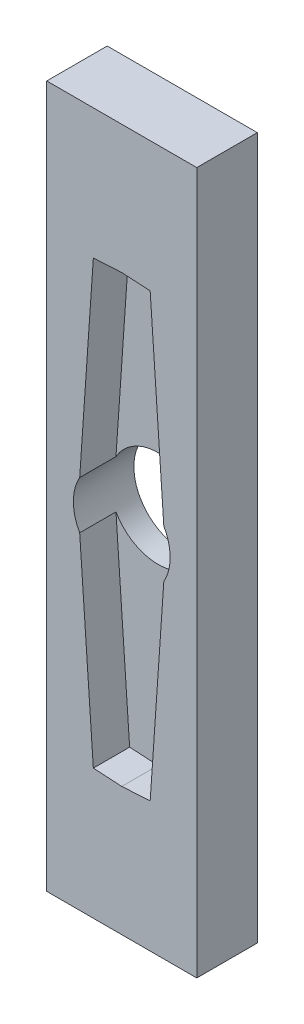
ISO-10303-21;
HEADER;
FILE_DESCRIPTION(('STEP AP214'),'2;1');
FILE_NAME('part.step','',(''),(''),'','','');
FILE_SCHEMA(('AUTOMOTIVE_DESIGN { 1 0 10303 214 1 1 1 1 }'));
ENDSEC;
DATA;
#1=APPLICATION_CONTEXT('core data for automotive mechanical design processes');
#2=APPLICATION_PROTOCOL_DEFINITION('international standard','automotive_design',2000,#1);
#3=PRODUCT_CONTEXT('',#1,'mechanical');
#4=PRODUCT('Part','Part','',(#3));
#5=PRODUCT_RELATED_PRODUCT_CATEGORY('part','',(#4));
#6=PRODUCT_DEFINITION_FORMATION('','',#4);
#7=PRODUCT_DEFINITION_CONTEXT('part definition',#1,'design');
#8=PRODUCT_DEFINITION('design','',#6,#7);
#9=PRODUCT_DEFINITION_SHAPE('','',#8);
#10=(LENGTH_UNIT() NAMED_UNIT(*) SI_UNIT(.MILLI.,.METRE.));
#11=(NAMED_UNIT(*) PLANE_ANGLE_UNIT() SI_UNIT($,.RADIAN.));
#12=(NAMED_UNIT(*) SI_UNIT($,.STERADIAN.) SOLID_ANGLE_UNIT());
#13=UNCERTAINTY_MEASURE_WITH_UNIT(LENGTH_MEASURE(1.E-05),#10,'distance_accuracy_value','');
#14=(GEOMETRIC_REPRESENTATION_CONTEXT(3) GLOBAL_UNCERTAINTY_ASSIGNED_CONTEXT((#13)) GLOBAL_UNIT_ASSIGNED_CONTEXT((#10,
#11,#12)) REPRESENTATION_CONTEXT('',''));
#15=CARTESIAN_POINT('',(0.,0.,0.));
#16=DIRECTION('',(0.,0.,1.));
#17=DIRECTION('',(1.,0.,0.));
#18=AXIS2_PLACEMENT_3D('',#15,#16,#17);
#19=CARTESIAN_POINT('',(0.,0.,-3.));
#20=DIRECTION('',(0.,0.,-1.));
#21=DIRECTION('',(-1.,0.,0.));
#22=AXIS2_PLACEMENT_3D('',#19,#20,#21);
#23=PLANE('',#22);
#24=DIRECTION('',(-0.0691677978064663,-0.997605039956497,0.));
#25=VECTOR('',#24,1.);
#26=CARTESIAN_POINT('',(-3.61380799217099,0.,-3.));
#27=LINE('',#26,#25);
#28=CARTESIAN_POINT('',(-2.34820149974734,18.2538038723774,-3.));
#29=VERTEX_POINT('',#28);
#30=CARTESIAN_POINT('',(-3.47665940987879,1.97808982296084,-3.));
#31=VERTEX_POINT('',#30);
#32=EDGE_CURVE('E324',#29,#31,#27,.T.);
#33=ORIENTED_EDGE('',*,*,#32,.T.);
#34=CARTESIAN_POINT('',(0.,0.,-3.));
#35=DIRECTION('',(0.,0.,-1.));
#36=DIRECTION('',(-1.,0.,0.));
#37=AXIS2_PLACEMENT_3D('',#34,#35,#36);
#38=CIRCLE('',#37,4.);
#39=CARTESIAN_POINT('',(3.47665940987879,1.97808982296084,-3.));
#40=VERTEX_POINT('',#39);
#41=EDGE_CURVE('E11',#31,#40,#38,.T.);
#42=ORIENTED_EDGE('',*,*,#41,.T.);
#43=DIRECTION('',(-0.0691677978064663,0.997605039956497,0.));
#44=VECTOR('',#43,1.);
#45=CARTESIAN_POINT('',(3.61380799217099,0.,-3.));
#46=LINE('',#45,#44);
#47=CARTESIAN_POINT('',(2.34820149974734,18.2538038723774,-3.));
#48=VERTEX_POINT('',#47);
#49=EDGE_CURVE('E167',#40,#48,#46,.T.);
#50=ORIENTED_EDGE('',*,*,#49,.T.);
#51=DIRECTION('',(-0.998375746778421,0.0569725218384344,0.));
#52=VECTOR('',#51,1.);
#53=CARTESIAN_POINT('',(0.,18.3878044845288,-3.));
#54=LINE('',#53,#52);
#55=CARTESIAN_POINT('',(0.,18.3878044845288,-3.));
#56=VERTEX_POINT('',#55);
#57=EDGE_CURVE('E313',#48,#56,#54,.T.);
#58=ORIENTED_EDGE('',*,*,#57,.T.);
#59=DIRECTION('',(-0.998375746778421,-0.0569725218384344,0.));
#60=VECTOR('',#59,1.);
#61=CARTESIAN_POINT('',(0.,18.3878044845288,-3.));
#62=LINE('',#61,#60);
#63=EDGE_CURVE('E320',#56,#29,#62,.T.);
#64=ORIENTED_EDGE('',*,*,#63,.T.);
#65=EDGE_LOOP('',(#33,#42,#50,#58,#64));
#66=FACE_BOUND('',#65,.T.);
#67=ADVANCED_FACE('F39',(#66),#23,.F.);
#68=CARTESIAN_POINT('',(-6.2,-29.,-5.));
#69=DIRECTION('',(-1.,0.,0.));
#70=DIRECTION('',(0.,0.,1.));
#71=AXIS2_PLACEMENT_3D('',#68,#69,#70);
#72=PLANE('',#71);
#73=DIRECTION('',(0.,-1.,0.));
#74=VECTOR('',#73,1.);
#75=CARTESIAN_POINT('',(-6.2,-29.,0.));
#76=LINE('',#75,#74);
#77=CARTESIAN_POINT('',(-6.2,29.,0.));
#78=VERTEX_POINT('',#77);
#79=CARTESIAN_POINT('',(-6.2,-29.,0.));
#80=VERTEX_POINT('',#79);
#81=EDGE_CURVE('E210',#78,#80,#76,.T.);
#82=ORIENTED_EDGE('',*,*,#81,.F.);
#83=DIRECTION('',(0.,0.,1.));
#84=VECTOR('',#83,1.);
#85=CARTESIAN_POINT('',(-6.2,29.,-5.));
#86=LINE('',#85,#84);
#87=CARTESIAN_POINT('',(-6.2,29.,-5.));
#88=VERTEX_POINT('',#87);
#89=EDGE_CURVE('E64',#88,#78,#86,.T.);
#90=ORIENTED_EDGE('',*,*,#89,.F.);
#91=DIRECTION('',(0.,-1.,0.));
#92=VECTOR('',#91,1.);
#93=CARTESIAN_POINT('',(-6.2,-29.,-5.));
#94=LINE('',#93,#92);
#95=CARTESIAN_POINT('',(-6.2,-29.,-5.));
#96=VERTEX_POINT('',#95);
#97=EDGE_CURVE('E228',#88,#96,#94,.T.);
#98=ORIENTED_EDGE('',*,*,#97,.T.);
#99=DIRECTION('',(0.,0.,1.));
#100=VECTOR('',#99,1.);
#101=CARTESIAN_POINT('',(-6.2,-29.,-5.));
#102=LINE('',#101,#100);
#103=EDGE_CURVE('E90',#96,#80,#102,.T.);
#104=ORIENTED_EDGE('',*,*,#103,.T.);
#105=EDGE_LOOP('',(#82,#90,#98,#104));
#106=FACE_BOUND('',#105,.T.);
#107=ADVANCED_FACE('F41',(#106),#72,.T.);
#108=CARTESIAN_POINT('',(6.2,29.,-5.));
#109=DIRECTION('',(0.,1.,0.));
#110=DIRECTION('',(0.,0.,1.));
#111=AXIS2_PLACEMENT_3D('',#108,#109,#110);
#112=PLANE('',#111);
#113=DIRECTION('',(-1.,0.,0.));
#114=VECTOR('',#113,1.);
#115=CARTESIAN_POINT('',(6.2,29.,0.));
#116=LINE('',#115,#114);
#117=CARTESIAN_POINT('',(6.2,29.,0.));
#118=VERTEX_POINT('',#117);
#119=EDGE_CURVE('E232',#118,#78,#116,.T.);
#120=ORIENTED_EDGE('',*,*,#119,.F.);
#121=DIRECTION('',(0.,0.,1.));
#122=VECTOR('',#121,1.);
#123=CARTESIAN_POINT('',(6.2,29.,-5.));
#124=LINE('',#123,#122);
#125=CARTESIAN_POINT('',(6.2,29.,-5.));
#126=VERTEX_POINT('',#125);
#127=EDGE_CURVE('E258',#126,#118,#124,.T.);
#128=ORIENTED_EDGE('',*,*,#127,.F.);
#129=DIRECTION('',(-1.,0.,0.));
#130=VECTOR('',#129,1.);
#131=CARTESIAN_POINT('',(6.2,29.,-5.));
#132=LINE('',#131,#130);
#133=EDGE_CURVE('E239',#126,#88,#132,.T.);
#134=ORIENTED_EDGE('',*,*,#133,.T.);
#135=ORIENTED_EDGE('',*,*,#89,.T.);
#136=EDGE_LOOP('',(#120,#128,#134,#135));
#137=FACE_BOUND('',#136,.T.);
#138=ADVANCED_FACE('F266',(#137),#112,.T.);
#139=CARTESIAN_POINT('',(6.2,-29.,-5.));
#140=DIRECTION('',(1.,0.,0.));
#141=DIRECTION('',(0.,0.,-1.));
#142=AXIS2_PLACEMENT_3D('',#139,#140,#141);
#143=PLANE('',#142);
#144=DIRECTION('',(0.,1.,0.));
#145=VECTOR('',#144,1.);
#146=CARTESIAN_POINT('',(6.2,-29.,0.));
#147=LINE('',#146,#145);
#148=CARTESIAN_POINT('',(6.2,-29.,0.));
#149=VERTEX_POINT('',#148);
#150=EDGE_CURVE('E249',#149,#118,#147,.T.);
#151=ORIENTED_EDGE('',*,*,#150,.F.);
#152=DIRECTION('',(0.,0.,1.));
#153=VECTOR('',#152,1.);
#154=CARTESIAN_POINT('',(6.2,-29.,-5.));
#155=LINE('',#154,#153);
#156=CARTESIAN_POINT('',(6.2,-29.,-5.));
#157=VERTEX_POINT('',#156);
#158=EDGE_CURVE('E261',#157,#149,#155,.T.);
#159=ORIENTED_EDGE('',*,*,#158,.F.);
#160=DIRECTION('',(0.,1.,0.));
#161=VECTOR('',#160,1.);
#162=CARTESIAN_POINT('',(6.2,-29.,-5.));
#163=LINE('',#162,#161);
#164=EDGE_CURVE('E235',#157,#126,#163,.T.);
#165=ORIENTED_EDGE('',*,*,#164,.T.);
#166=ORIENTED_EDGE('',*,*,#127,.T.);
#167=EDGE_LOOP('',(#151,#159,#165,#166));
#168=FACE_BOUND('',#167,.T.);
#169=ADVANCED_FACE('F270',(#168),#143,.T.);
#170=CARTESIAN_POINT('',(6.2,-29.,-5.));
#171=DIRECTION('',(0.,-1.,0.));
#172=DIRECTION('',(0.,0.,-1.));
#173=AXIS2_PLACEMENT_3D('',#170,#171,#172);
#174=PLANE('',#173);
#175=DIRECTION('',(1.,0.,0.));
#176=VECTOR('',#175,1.);
#177=CARTESIAN_POINT('',(6.2,-29.,0.));
#178=LINE('',#177,#176);
#179=EDGE_CURVE('E245',#80,#149,#178,.T.);
#180=ORIENTED_EDGE('',*,*,#179,.F.);
#181=ORIENTED_EDGE('',*,*,#103,.F.);
#182=DIRECTION('',(1.,0.,0.));
#183=VECTOR('',#182,1.);
#184=CARTESIAN_POINT('',(6.2,-29.,-5.));
#185=LINE('',#184,#183);
#186=EDGE_CURVE('E231',#96,#157,#185,.T.);
#187=ORIENTED_EDGE('',*,*,#186,.T.);
#188=ORIENTED_EDGE('',*,*,#158,.T.);
#189=EDGE_LOOP('',(#180,#181,#187,#188));
#190=FACE_BOUND('',#189,.T.);
#191=ADVANCED_FACE('F264',(#190),#174,.T.);
#192=CARTESIAN_POINT('',(0.,0.,-5.));
#193=DIRECTION('',(0.,0.,1.));
#194=DIRECTION('',(1.,0.,0.));
#195=AXIS2_PLACEMENT_3D('',#192,#193,#194);
#196=PLANE('',#195);
#197=CARTESIAN_POINT('',(0.,0.,-5.));
#198=DIRECTION('',(0.,0.,1.));
#199=DIRECTION('',(1.,0.,0.));
#200=AXIS2_PLACEMENT_3D('',#197,#198,#199);
#201=CIRCLE('',#200,4.);
#202=CARTESIAN_POINT('',(4.,0.,-5.));
#203=VERTEX_POINT('',#202);
#204=EDGE_CURVE('E345',#203,#203,#201,.T.);
#205=ORIENTED_EDGE('',*,*,#204,.T.);
#206=EDGE_LOOP('',(#205));
#207=FACE_BOUND('',#206,.T.);
#208=ORIENTED_EDGE('',*,*,#97,.F.);
#209=ORIENTED_EDGE('',*,*,#133,.F.);
#210=ORIENTED_EDGE('',*,*,#164,.F.);
#211=ORIENTED_EDGE('',*,*,#186,.F.);
#212=EDGE_LOOP('',(#208,#209,#210,#211));
#213=FACE_BOUND('',#212,.T.);
#214=ADVANCED_FACE('F272',(#207,#213),#196,.F.);
#215=CARTESIAN_POINT('',(0.,0.,0.));
#216=DIRECTION('',(0.,0.,1.));
#217=DIRECTION('',(1.,0.,0.));
#218=AXIS2_PLACEMENT_3D('',#215,#216,#217);
#219=PLANE('',#218);
#220=CARTESIAN_POINT('',(0.,0.,0.));
#221=DIRECTION('',(0.,0.,1.));
#222=DIRECTION('',(1.,0.,0.));
#223=AXIS2_PLACEMENT_3D('',#220,#221,#222);
#224=CIRCLE('',#223,4.);
#225=CARTESIAN_POINT('',(-3.47665940987879,1.97808982296084,0.));
#226=VERTEX_POINT('',#225);
#227=CARTESIAN_POINT('',(-3.47665940987879,-1.97808982296084,0.));
#228=VERTEX_POINT('',#227);
#229=EDGE_CURVE('E159',#226,#228,#224,.T.);
#230=ORIENTED_EDGE('',*,*,#229,.F.);
#231=DIRECTION('',(-0.0691677978064663,-0.997605039956497,0.));
#232=VECTOR('',#231,1.);
#233=CARTESIAN_POINT('',(-3.61380799217099,0.,0.));
#234=LINE('',#233,#232);
#235=CARTESIAN_POINT('',(-2.34820149974734,18.2538038723774,0.));
#236=VERTEX_POINT('',#235);
#237=EDGE_CURVE('E191',#236,#226,#234,.T.);
#238=ORIENTED_EDGE('',*,*,#237,.F.);
#239=DIRECTION('',(-0.998375746778421,-0.0569725218384344,0.));
#240=VECTOR('',#239,1.);
#241=CARTESIAN_POINT('',(0.,18.3878044845288,0.));
#242=LINE('',#241,#240);
#243=CARTESIAN_POINT('',(0.,18.3878044845288,0.));
#244=VERTEX_POINT('',#243);
#245=EDGE_CURVE('E183',#244,#236,#242,.T.);
#246=ORIENTED_EDGE('',*,*,#245,.F.);
#247=DIRECTION('',(-0.998375746778421,0.0569725218384344,0.));
#248=VECTOR('',#247,1.);
#249=CARTESIAN_POINT('',(0.,18.3878044845288,0.));
#250=LINE('',#249,#248);
#251=CARTESIAN_POINT('',(2.34820149974734,18.2538038723774,0.));
#252=VERTEX_POINT('',#251);
#253=EDGE_CURVE('E177',#252,#244,#250,.T.);
#254=ORIENTED_EDGE('',*,*,#253,.F.);
#255=DIRECTION('',(-0.0691677978064663,0.997605039956497,0.));
#256=VECTOR('',#255,1.);
#257=CARTESIAN_POINT('',(3.61380799217099,0.,0.));
#258=LINE('',#257,#256);
#259=CARTESIAN_POINT('',(3.47665940987879,1.97808982296084,0.));
#260=VERTEX_POINT('',#259);
#261=EDGE_CURVE('E165',#260,#252,#258,.T.);
#262=ORIENTED_EDGE('',*,*,#261,.F.);
#263=CARTESIAN_POINT('',(3.47665940987879,-1.97808982296084,0.));
#264=VERTEX_POINT('',#263);
#265=EDGE_CURVE('E148',#264,#260,#224,.T.);
#266=ORIENTED_EDGE('',*,*,#265,.F.);
#267=DIRECTION('',(0.0691677978064663,0.997605039956497,0.));
#268=VECTOR('',#267,1.);
#269=CARTESIAN_POINT('',(3.61380799217099,0.,0.));
#270=LINE('',#269,#268);
#271=CARTESIAN_POINT('',(2.34820149974734,-18.2538038723774,0.));
#272=VERTEX_POINT('',#271);
#273=EDGE_CURVE('E179',#272,#264,#270,.T.);
#274=ORIENTED_EDGE('',*,*,#273,.F.);
#275=DIRECTION('',(0.998375746778421,0.0569725218384344,0.));
#276=VECTOR('',#275,1.);
#277=CARTESIAN_POINT('',(0.,-18.3878044845288,0.));
#278=LINE('',#277,#276);
#279=CARTESIAN_POINT('',(0.,-18.3878044845288,0.));
#280=VERTEX_POINT('',#279);
#281=EDGE_CURVE('E202',#280,#272,#278,.T.);
#282=ORIENTED_EDGE('',*,*,#281,.F.);
#283=DIRECTION('',(0.998375746778421,-0.0569725218384344,0.));
#284=VECTOR('',#283,1.);
#285=CARTESIAN_POINT('',(0.,-18.3878044845288,0.));
#286=LINE('',#285,#284);
#287=CARTESIAN_POINT('',(-2.34820149974734,-18.2538038723774,0.));
#288=VERTEX_POINT('',#287);
#289=EDGE_CURVE('E198',#288,#280,#286,.T.);
#290=ORIENTED_EDGE('',*,*,#289,.F.);
#291=DIRECTION('',(0.0691677978064663,-0.997605039956497,0.));
#292=VECTOR('',#291,1.);
#293=CARTESIAN_POINT('',(-3.61380799217099,0.,0.));
#294=LINE('',#293,#292);
#295=EDGE_CURVE('E195',#228,#288,#294,.T.);
#296=ORIENTED_EDGE('',*,*,#295,.F.);
#297=EDGE_LOOP('',(#230,#238,#246,#254,#262,#266,#274,#282,#290,#296));
#298=FACE_BOUND('',#297,.T.);
#299=ORIENTED_EDGE('',*,*,#81,.T.);
#300=ORIENTED_EDGE('',*,*,#179,.T.);
#301=ORIENTED_EDGE('',*,*,#150,.T.);
#302=ORIENTED_EDGE('',*,*,#119,.T.);
#303=EDGE_LOOP('',(#299,#300,#301,#302));
#304=FACE_BOUND('',#303,.T.);
#305=ADVANCED_FACE('F173',(#298,#304),#219,.T.);
#306=CARTESIAN_POINT('',(3.61380799217099,0.,-3.));
#307=DIRECTION('',(0.997605039956497,-0.0691677978064663,0.));
#308=DIRECTION('',(0.0691677978064663,0.997605039956497,0.));
#309=AXIS2_PLACEMENT_3D('',#306,#307,#308);
#310=PLANE('',#309);
#311=ORIENTED_EDGE('',*,*,#273,.T.);
#312=DIRECTION('',(0.,0.,1.));
#313=VECTOR('',#312,1.);
#314=CARTESIAN_POINT('',(3.47665940987879,-1.97808982296084,-5.));
#315=LINE('',#314,#313);
#316=CARTESIAN_POINT('',(3.47665940987879,-1.97808982296084,-3.));
#317=VERTEX_POINT('',#316);
#318=EDGE_CURVE('E153',#264,#317,#315,.F.);
#319=ORIENTED_EDGE('',*,*,#318,.T.);
#320=DIRECTION('',(0.0691677978064663,0.997605039956497,0.));
#321=VECTOR('',#320,1.);
#322=CARTESIAN_POINT('',(3.61380799217099,0.,-3.));
#323=LINE('',#322,#321);
#324=CARTESIAN_POINT('',(2.34820149974734,-18.2538038723774,-3.));
#325=VERTEX_POINT('',#324);
#326=EDGE_CURVE('E206',#325,#317,#323,.T.);
#327=ORIENTED_EDGE('',*,*,#326,.F.);
#328=DIRECTION('',(0.,0.,1.));
#329=VECTOR('',#328,1.);
#330=CARTESIAN_POINT('',(2.34820149974734,-18.2538038723774,-3.));
#331=LINE('',#330,#329);
#332=EDGE_CURVE('E207',#325,#272,#331,.T.);
#333=ORIENTED_EDGE('',*,*,#332,.T.);
#334=EDGE_LOOP('',(#311,#319,#327,#333));
#335=FACE_BOUND('',#334,.T.);
#336=ADVANCED_FACE('F280',(#335),#310,.F.);
#337=CARTESIAN_POINT('',(0.,-18.3878044845288,-3.));
#338=DIRECTION('',(0.0569725218384344,-0.998375746778421,0.));
#339=DIRECTION('',(0.998375746778421,0.0569725218384344,0.));
#340=AXIS2_PLACEMENT_3D('',#337,#338,#339);
#341=PLANE('',#340);
#342=ORIENTED_EDGE('',*,*,#281,.T.);
#343=ORIENTED_EDGE('',*,*,#332,.F.);
#344=DIRECTION('',(0.998375746778421,0.0569725218384344,0.));
#345=VECTOR('',#344,1.);
#346=CARTESIAN_POINT('',(0.,-18.3878044845288,-3.));
#347=LINE('',#346,#345);
#348=CARTESIAN_POINT('',(0.,-18.3878044845288,-3.));
#349=VERTEX_POINT('',#348);
#350=EDGE_CURVE('E227',#349,#325,#347,.T.);
#351=ORIENTED_EDGE('',*,*,#350,.F.);
#352=DIRECTION('',(0.,0.,1.));
#353=VECTOR('',#352,1.);
#354=CARTESIAN_POINT('',(0.,-18.3878044845288,-3.));
#355=LINE('',#354,#353);
#356=EDGE_CURVE('E211',#349,#280,#355,.T.);
#357=ORIENTED_EDGE('',*,*,#356,.T.);
#358=EDGE_LOOP('',(#342,#343,#351,#357));
#359=FACE_BOUND('',#358,.T.);
#360=ADVANCED_FACE('F337',(#359),#341,.F.);
#361=CARTESIAN_POINT('',(0.,-18.3878044845288,-3.));
#362=DIRECTION('',(-0.0569725218384344,-0.998375746778421,0.));
#363=DIRECTION('',(0.998375746778421,-0.0569725218384344,0.));
#364=AXIS2_PLACEMENT_3D('',#361,#362,#363);
#365=PLANE('',#364);
#366=ORIENTED_EDGE('',*,*,#289,.T.);
#367=ORIENTED_EDGE('',*,*,#356,.F.);
#368=DIRECTION('',(0.998375746778421,-0.0569725218384344,0.));
#369=VECTOR('',#368,1.);
#370=CARTESIAN_POINT('',(0.,-18.3878044845288,-3.));
#371=LINE('',#370,#369);
#372=CARTESIAN_POINT('',(-2.34820149974734,-18.2538038723774,-3.));
#373=VERTEX_POINT('',#372);
#374=EDGE_CURVE('E330',#373,#349,#371,.T.);
#375=ORIENTED_EDGE('',*,*,#374,.F.);
#376=DIRECTION('',(0.,0.,1.));
#377=VECTOR('',#376,1.);
#378=CARTESIAN_POINT('',(-2.34820149974734,-18.2538038723774,-3.));
#379=LINE('',#378,#377);
#380=EDGE_CURVE('E214',#373,#288,#379,.T.);
#381=ORIENTED_EDGE('',*,*,#380,.T.);
#382=EDGE_LOOP('',(#366,#367,#375,#381));
#383=FACE_BOUND('',#382,.T.);
#384=ADVANCED_FACE('F341',(#383),#365,.F.);
#385=CARTESIAN_POINT('',(-3.61380799217099,0.,-3.));
#386=DIRECTION('',(-0.997605039956497,-0.0691677978064663,0.));
#387=DIRECTION('',(0.0691677978064663,-0.997605039956497,0.));
#388=AXIS2_PLACEMENT_3D('',#385,#386,#387);
#389=PLANE('',#388);
#390=DIRECTION('',(0.0691677978064663,-0.997605039956497,0.));
#391=VECTOR('',#390,1.);
#392=CARTESIAN_POINT('',(-3.61380799217099,0.,-3.));
#393=LINE('',#392,#391);
#394=CARTESIAN_POINT('',(-3.47665940987879,-1.97808982296084,-3.));
#395=VERTEX_POINT('',#394);
#396=EDGE_CURVE('E327',#395,#373,#393,.T.);
#397=ORIENTED_EDGE('',*,*,#396,.F.);
#398=DIRECTION('',(0.,0.,1.));
#399=VECTOR('',#398,1.);
#400=CARTESIAN_POINT('',(-3.47665940987879,-1.97808982296084,-5.));
#401=LINE('',#400,#399);
#402=EDGE_CURVE('E55',#395,#228,#401,.T.);
#403=ORIENTED_EDGE('',*,*,#402,.T.);
#404=ORIENTED_EDGE('',*,*,#295,.T.);
#405=ORIENTED_EDGE('',*,*,#380,.F.);
#406=EDGE_LOOP('',(#397,#403,#404,#405));
#407=FACE_BOUND('',#406,.T.);
#408=ADVANCED_FACE('F343',(#407),#389,.F.);
#409=CARTESIAN_POINT('',(-3.61380799217099,0.,-3.));
#410=DIRECTION('',(-0.997605039956497,0.0691677978064663,0.));
#411=DIRECTION('',(-0.0691677978064663,-0.997605039956497,0.));
#412=AXIS2_PLACEMENT_3D('',#409,#410,#411);
#413=PLANE('',#412);
#414=ORIENTED_EDGE('',*,*,#237,.T.);
#415=DIRECTION('',(0.,0.,1.));
#416=VECTOR('',#415,1.);
#417=CARTESIAN_POINT('',(-3.47665940987879,1.97808982296084,-5.));
#418=LINE('',#417,#416);
#419=EDGE_CURVE('E169',#226,#31,#418,.F.);
#420=ORIENTED_EDGE('',*,*,#419,.T.);
#421=ORIENTED_EDGE('',*,*,#32,.F.);
#422=DIRECTION('',(0.,0.,1.));
#423=VECTOR('',#422,1.);
#424=CARTESIAN_POINT('',(-2.34820149974734,18.2538038723774,-3.));
#425=LINE('',#424,#423);
#426=EDGE_CURVE('E218',#29,#236,#425,.T.);
#427=ORIENTED_EDGE('',*,*,#426,.T.);
#428=EDGE_LOOP('',(#414,#420,#421,#427));
#429=FACE_BOUND('',#428,.T.);
#430=ADVANCED_FACE('F356',(#429),#413,.F.);
#431=CARTESIAN_POINT('',(0.,18.3878044845288,-3.));
#432=DIRECTION('',(-0.0569725218384344,0.998375746778421,0.));
#433=DIRECTION('',(-0.998375746778421,-0.0569725218384344,0.));
#434=AXIS2_PLACEMENT_3D('',#431,#432,#433);
#435=PLANE('',#434);
#436=ORIENTED_EDGE('',*,*,#245,.T.);
#437=ORIENTED_EDGE('',*,*,#426,.F.);
#438=ORIENTED_EDGE('',*,*,#63,.F.);
#439=DIRECTION('',(0.,0.,1.));
#440=VECTOR('',#439,1.);
#441=CARTESIAN_POINT('',(0.,18.3878044845288,-3.));
#442=LINE('',#441,#440);
#443=EDGE_CURVE('E221',#56,#244,#442,.T.);
#444=ORIENTED_EDGE('',*,*,#443,.T.);
#445=EDGE_LOOP('',(#436,#437,#438,#444));
#446=FACE_BOUND('',#445,.T.);
#447=ADVANCED_FACE('F360',(#446),#435,.F.);
#448=CARTESIAN_POINT('',(0.,18.3878044845288,-3.));
#449=DIRECTION('',(0.0569725218384344,0.998375746778421,0.));
#450=DIRECTION('',(-0.998375746778421,0.0569725218384344,0.));
#451=AXIS2_PLACEMENT_3D('',#448,#449,#450);
#452=PLANE('',#451);
#453=ORIENTED_EDGE('',*,*,#253,.T.);
#454=ORIENTED_EDGE('',*,*,#443,.F.);
#455=ORIENTED_EDGE('',*,*,#57,.F.);
#456=DIRECTION('',(0.,0.,1.));
#457=VECTOR('',#456,1.);
#458=CARTESIAN_POINT('',(2.34820149974734,18.2538038723774,-3.));
#459=LINE('',#458,#457);
#460=EDGE_CURVE('E224',#48,#252,#459,.T.);
#461=ORIENTED_EDGE('',*,*,#460,.T.);
#462=EDGE_LOOP('',(#453,#454,#455,#461));
#463=FACE_BOUND('',#462,.T.);
#464=ADVANCED_FACE('F301',(#463),#452,.F.);
#465=CARTESIAN_POINT('',(3.61380799217099,0.,-3.));
#466=DIRECTION('',(0.997605039956497,0.0691677978064663,0.));
#467=DIRECTION('',(-0.0691677978064663,0.997605039956497,0.));
#468=AXIS2_PLACEMENT_3D('',#465,#466,#467);
#469=PLANE('',#468);
#470=ORIENTED_EDGE('',*,*,#49,.F.);
#471=DIRECTION('',(0.,0.,1.));
#472=VECTOR('',#471,1.);
#473=CARTESIAN_POINT('',(3.47665940987879,1.97808982296084,-5.));
#474=LINE('',#473,#472);
#475=EDGE_CURVE('E151',#40,#260,#474,.T.);
#476=ORIENTED_EDGE('',*,*,#475,.T.);
#477=ORIENTED_EDGE('',*,*,#261,.T.);
#478=ORIENTED_EDGE('',*,*,#460,.F.);
#479=EDGE_LOOP('',(#470,#476,#477,#478));
#480=FACE_BOUND('',#479,.T.);
#481=ADVANCED_FACE('F163',(#480),#469,.F.);
#482=ORIENTED_EDGE('',*,*,#326,.T.);
#483=EDGE_CURVE('E43',#317,#395,#38,.T.);
#484=ORIENTED_EDGE('',*,*,#483,.T.);
#485=ORIENTED_EDGE('',*,*,#396,.T.);
#486=ORIENTED_EDGE('',*,*,#374,.T.);
#487=ORIENTED_EDGE('',*,*,#350,.T.);
#488=EDGE_LOOP('',(#482,#484,#485,#486,#487));
#489=FACE_BOUND('',#488,.T.);
#490=ADVANCED_FACE('F287',(#489),#23,.F.);
#491=CARTESIAN_POINT('',(0.,0.,-5.));
#492=DIRECTION('',(0.,0.,1.));
#493=DIRECTION('',(1.,0.,0.));
#494=AXIS2_PLACEMENT_3D('',#491,#492,#493);
#495=CYLINDRICAL_SURFACE('',#494,4.);
#496=ORIENTED_EDGE('',*,*,#204,.F.);
#497=EDGE_LOOP('',(#496));
#498=FACE_BOUND('',#497,.T.);
#499=ORIENTED_EDGE('',*,*,#229,.T.);
#500=ORIENTED_EDGE('',*,*,#402,.F.);
#501=ORIENTED_EDGE('',*,*,#483,.F.);
#502=ORIENTED_EDGE('',*,*,#318,.F.);
#503=ORIENTED_EDGE('',*,*,#265,.T.);
#504=ORIENTED_EDGE('',*,*,#475,.F.);
#505=ORIENTED_EDGE('',*,*,#41,.F.);
#506=ORIENTED_EDGE('',*,*,#419,.F.);
#507=EDGE_LOOP('',(#499,#500,#501,#502,#503,#504,#505,#506));
#508=FACE_BOUND('',#507,.T.);
#509=ADVANCED_FACE('F150',(#498,#508),#495,.F.);
#510=CLOSED_SHELL('',(#67,#107,#138,#169,#191,#214,#305,#336,#360,#384,#408,#430,#447,#464,#481,
#490,#509));
#511=MANIFOLD_SOLID_BREP('B2',#510);
#512=ADVANCED_BREP_SHAPE_REPRESENTATION('',(#18,#511),#14);
#513=SHAPE_DEFINITION_REPRESENTATION(#9,#512);
ENDSEC;
END-ISO-10303-21;
